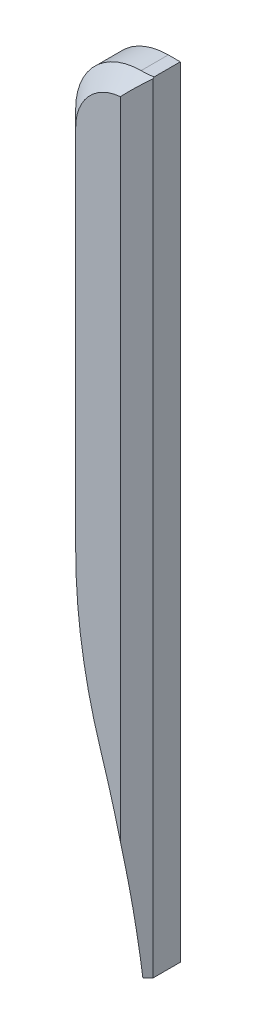
ISO-10303-21;
HEADER;
FILE_DESCRIPTION(('STEP AP214'),'2;1');
FILE_NAME('part.step','',(''),(''),'','','');
FILE_SCHEMA(('AUTOMOTIVE_DESIGN { 1 0 10303 214 1 1 1 1 }'));
ENDSEC;
DATA;
#1=APPLICATION_CONTEXT('core data for automotive mechanical design processes');
#2=APPLICATION_PROTOCOL_DEFINITION('international standard','automotive_design',2000,#1);
#3=PRODUCT_CONTEXT('',#1,'mechanical');
#4=PRODUCT('Part','Part','',(#3));
#5=PRODUCT_RELATED_PRODUCT_CATEGORY('part','',(#4));
#6=PRODUCT_DEFINITION_FORMATION('','',#4);
#7=PRODUCT_DEFINITION_CONTEXT('part definition',#1,'design');
#8=PRODUCT_DEFINITION('design','',#6,#7);
#9=PRODUCT_DEFINITION_SHAPE('','',#8);
#10=(LENGTH_UNIT() NAMED_UNIT(*) SI_UNIT(.MILLI.,.METRE.));
#11=(NAMED_UNIT(*) PLANE_ANGLE_UNIT() SI_UNIT($,.RADIAN.));
#12=(NAMED_UNIT(*) SI_UNIT($,.STERADIAN.) SOLID_ANGLE_UNIT());
#13=UNCERTAINTY_MEASURE_WITH_UNIT(LENGTH_MEASURE(1.E-05),#10,'distance_accuracy_value','');
#14=(GEOMETRIC_REPRESENTATION_CONTEXT(3) GLOBAL_UNCERTAINTY_ASSIGNED_CONTEXT((#13)) GLOBAL_UNIT_ASSIGNED_CONTEXT((#10,
#11,#12)) REPRESENTATION_CONTEXT('',''));
#15=CARTESIAN_POINT('',(0.,0.,0.));
#16=DIRECTION('',(0.,0.,1.));
#17=DIRECTION('',(1.,0.,0.));
#18=AXIS2_PLACEMENT_3D('',#15,#16,#17);
#19=CARTESIAN_POINT('',(-1.09999999999947,79.2576753062959,4.));
#20=DIRECTION('',(0.,0.,-1.));
#21=DIRECTION('',(-1.,0.,0.));
#22=AXIS2_PLACEMENT_3D('',#19,#20,#21);
#23=CYLINDRICAL_SURFACE('',#22,5.99999999999999);
#24=DIRECTION('',(0.,0.,-1.));
#25=VECTOR('',#24,1.);
#26=CARTESIAN_POINT('',(-7.09999999999946,79.2576753062959,4.));
#27=LINE('',#26,#25);
#28=CARTESIAN_POINT('',(-7.09999999999946,79.2576753062959,2.49999999999999));
#29=VERTEX_POINT('',#28);
#30=CARTESIAN_POINT('',(-7.09999999999946,79.2576753062959,0.));
#31=VERTEX_POINT('',#30);
#32=EDGE_CURVE('E141',#29,#31,#27,.T.);
#33=ORIENTED_EDGE('',*,*,#32,.F.);
#34=CARTESIAN_POINT('',(-1.09999999999947,79.2576753062959,2.49999999999999));
#35=DIRECTION('',(0.,0.,1.));
#36=DIRECTION('',(1.,0.,0.));
#37=AXIS2_PLACEMENT_3D('',#34,#35,#36);
#38=CIRCLE('',#37,5.99999999999999);
#39=CARTESIAN_POINT('',(-1.10000000000005,85.2576753062959,2.49999999999999));
#40=VERTEX_POINT('',#39);
#41=EDGE_CURVE('E232',#29,#40,#38,.F.);
#42=ORIENTED_EDGE('',*,*,#41,.T.);
#43=DIRECTION('',(0.,0.,-1.));
#44=VECTOR('',#43,1.);
#45=CARTESIAN_POINT('',(-1.10000000000005,85.2576753062959,4.));
#46=LINE('',#45,#44);
#47=CARTESIAN_POINT('',(-1.10000000000005,85.2576753062959,0.));
#48=VERTEX_POINT('',#47);
#49=EDGE_CURVE('E149',#40,#48,#46,.T.);
#50=ORIENTED_EDGE('',*,*,#49,.T.);
#51=CARTESIAN_POINT('',(-1.09999999999947,79.2576753062959,0.));
#52=DIRECTION('',(0.,0.,1.));
#53=DIRECTION('',(1.,0.,0.));
#54=AXIS2_PLACEMENT_3D('',#51,#52,#53);
#55=CIRCLE('',#54,5.99999999999999);
#56=EDGE_CURVE('E270',#48,#31,#55,.T.);
#57=ORIENTED_EDGE('',*,*,#56,.T.);
#58=EDGE_LOOP('',(#33,#42,#50,#57));
#59=FACE_BOUND('',#58,.T.);
#60=ADVANCED_FACE('F37',(#59),#23,.T.);
#61=CARTESIAN_POINT('',(-7.09999999999946,79.2576753062959,4.));
#62=DIRECTION('',(1.,0.,0.));
#63=DIRECTION('',(0.,0.,-1.));
#64=AXIS2_PLACEMENT_3D('',#61,#62,#63);
#65=PLANE('',#64);
#66=DIRECTION('',(0.,0.,-1.));
#67=VECTOR('',#66,1.);
#68=CARTESIAN_POINT('',(-7.09999999999946,45.6025218600902,4.));
#69=LINE('',#68,#67);
#70=CARTESIAN_POINT('',(-7.09999999999946,45.6025218600902,2.49999999999999));
#71=VERTEX_POINT('',#70);
#72=CARTESIAN_POINT('',(-7.09999999999946,45.6025218600902,0.));
#73=VERTEX_POINT('',#72);
#74=EDGE_CURVE('E160',#71,#73,#69,.T.);
#75=ORIENTED_EDGE('',*,*,#74,.F.);
#76=DIRECTION('',(0.,1.,0.));
#77=VECTOR('',#76,1.);
#78=CARTESIAN_POINT('',(-7.09999999999946,79.2576753062959,2.49999999999999));
#79=LINE('',#78,#77);
#80=EDGE_CURVE('E11',#71,#29,#79,.T.);
#81=ORIENTED_EDGE('',*,*,#80,.T.);
#82=ORIENTED_EDGE('',*,*,#32,.T.);
#83=DIRECTION('',(0.,-1.,0.));
#84=VECTOR('',#83,1.);
#85=CARTESIAN_POINT('',(-7.09999999999946,79.2576753062959,0.));
#86=LINE('',#85,#84);
#87=EDGE_CURVE('E272',#31,#73,#86,.T.);
#88=ORIENTED_EDGE('',*,*,#87,.T.);
#89=EDGE_LOOP('',(#75,#81,#82,#88));
#90=FACE_BOUND('',#89,.T.);
#91=ADVANCED_FACE('F277',(#90),#65,.F.);
#92=CARTESIAN_POINT('',(42.9000000000005,45.6025218600902,4.));
#93=DIRECTION('',(0.,0.,-1.));
#94=DIRECTION('',(-1.,0.,0.));
#95=AXIS2_PLACEMENT_3D('',#92,#93,#94);
#96=CYLINDRICAL_SURFACE('',#95,50.);
#97=DIRECTION('',(0.,0.,-1.));
#98=VECTOR('',#97,1.);
#99=CARTESIAN_POINT('',(-4.73333333333305,30.4016812400601,4.));
#100=LINE('',#99,#98);
#101=CARTESIAN_POINT('',(-4.73333333333305,30.4016812400601,2.49999999999999));
#102=VERTEX_POINT('',#101);
#103=CARTESIAN_POINT('',(-4.73333333333305,30.4016812400601,0.));
#104=VERTEX_POINT('',#103);
#105=EDGE_CURVE('E158',#102,#104,#100,.T.);
#106=ORIENTED_EDGE('',*,*,#105,.F.);
#107=CARTESIAN_POINT('',(42.9000000000005,45.6025218600902,2.49999999999999));
#108=DIRECTION('',(0.,0.,1.));
#109=DIRECTION('',(1.,0.,0.));
#110=AXIS2_PLACEMENT_3D('',#107,#108,#109);
#111=CIRCLE('',#110,50.);
#112=EDGE_CURVE('E47',#102,#71,#111,.F.);
#113=ORIENTED_EDGE('',*,*,#112,.T.);
#114=ORIENTED_EDGE('',*,*,#74,.T.);
#115=CARTESIAN_POINT('',(42.9000000000005,45.6025218600902,0.));
#116=DIRECTION('',(0.,0.,1.));
#117=DIRECTION('',(1.,0.,0.));
#118=AXIS2_PLACEMENT_3D('',#115,#116,#117);
#119=CIRCLE('',#118,50.);
#120=EDGE_CURVE('E151',#73,#104,#119,.T.);
#121=ORIENTED_EDGE('',*,*,#120,.T.);
#122=EDGE_LOOP('',(#106,#113,#114,#121));
#123=FACE_BOUND('',#122,.T.);
#124=ADVANCED_FACE('F263',(#123),#96,.T.);
#125=CARTESIAN_POINT('',(-99.9999999999995,0.,4.));
#126=DIRECTION('',(0.,0.,-1.));
#127=DIRECTION('',(-1.,0.,0.));
#128=AXIS2_PLACEMENT_3D('',#125,#126,#127);
#129=CYLINDRICAL_SURFACE('',#128,99.9999999999998);
#130=DIRECTION('',(0.,0.,-1.));
#131=VECTOR('',#130,1.);
#132=CARTESIAN_POINT('',(-0.938840704638136,13.6706517422909,4.));
#133=LINE('',#132,#131);
#134=CARTESIAN_POINT('',(-0.938840704638136,13.6706517422909,0.));
#135=VERTEX_POINT('',#134);
#136=CARTESIAN_POINT('',(-0.938840704638136,13.6706517422909,2.49999999999999));
#137=VERTEX_POINT('',#136);
#138=EDGE_CURVE('E131',#135,#137,#133,.F.);
#139=ORIENTED_EDGE('',*,*,#138,.T.);
#140=CARTESIAN_POINT('',(-99.9999999999995,0.,2.49999999999999));
#141=DIRECTION('',(0.,0.,1.));
#142=DIRECTION('',(1.,0.,0.));
#143=AXIS2_PLACEMENT_3D('',#140,#141,#142);
#144=CIRCLE('',#143,99.9999999999998);
#145=EDGE_CURVE('E209',#137,#102,#144,.T.);
#146=ORIENTED_EDGE('',*,*,#145,.T.);
#147=ORIENTED_EDGE('',*,*,#105,.T.);
#148=CARTESIAN_POINT('',(-99.9999999999995,0.,0.));
#149=DIRECTION('',(0.,0.,-1.));
#150=DIRECTION('',(1.,0.,0.));
#151=AXIS2_PLACEMENT_3D('',#148,#149,#150);
#152=CIRCLE('',#151,99.9999999999998);
#153=EDGE_CURVE('E147',#104,#135,#152,.T.);
#154=ORIENTED_EDGE('',*,*,#153,.T.);
#155=EDGE_LOOP('',(#139,#146,#147,#154));
#156=FACE_BOUND('',#155,.T.);
#157=ADVANCED_FACE('F260',(#156),#129,.F.);
#158=CARTESIAN_POINT('',(0.,0.,4.));
#159=DIRECTION('',(-1.,0.,0.));
#160=DIRECTION('',(0.,-1.,0.));
#161=AXIS2_PLACEMENT_3D('',#158,#159,#160);
#162=PLANE('',#161);
#163=DIRECTION('',(0.,0.,-1.));
#164=VECTOR('',#163,1.);
#165=CARTESIAN_POINT('',(-5.50774703622636E-13,85.2576753062959,4.));
#166=LINE('',#165,#164);
#167=CARTESIAN_POINT('',(-5.50774703622636E-13,85.2576753062959,2.40000000000019));
#168=VERTEX_POINT('',#167);
#169=CARTESIAN_POINT('',(-5.50774703622636E-13,85.2576753062959,0.));
#170=VERTEX_POINT('',#169);
#171=EDGE_CURVE('E156',#168,#170,#166,.T.);
#172=ORIENTED_EDGE('',*,*,#171,.F.);
#173=CARTESIAN_POINT('',(-5.50774703622636E-13,85.2576753062959,2.40000000000019));
#174=CARTESIAN_POINT('',(-5.50665225056846E-13,85.2407284675544,2.41666906096395));
#175=CARTESIAN_POINT('',(-5.50555738874105E-13,85.2237804516193,2.4333369247788));
#176=CARTESIAN_POINT('',(-5.50336751274715E-13,85.1898820653606,2.46667025811206));
#177=CARTESIAN_POINT('',(-5.50227249858065E-13,85.1729316950369,2.48333572763048));
#178=CARTESIAN_POINT('',(-5.50117740824464E-13,85.1559801475196,2.49999999999998));
#179=B_SPLINE_CURVE_WITH_KNOTS('',3,(#173,#174,#175,#176,#177,#178),.UNSPECIFIED.,.F.,.F.,(4,2,
4),(0.,0.0713125259304227,0.142625051866725),.UNSPECIFIED.);
#180=CARTESIAN_POINT('',(-5.50117740824464E-13,85.1559801475196,2.49999999999999));
#181=VERTEX_POINT('',#180);
#182=EDGE_CURVE('E231',#168,#181,#179,.T.);
#183=ORIENTED_EDGE('',*,*,#182,.T.);
#184=DIRECTION('',(0.,-1.,0.));
#185=VECTOR('',#184,1.);
#186=CARTESIAN_POINT('',(0.,13.6706517422909,2.49999999999999));
#187=LINE('',#186,#185);
#188=CARTESIAN_POINT('',(0.,13.6706517422909,2.49999999999999));
#189=VERTEX_POINT('',#188);
#190=EDGE_CURVE('E127',#181,#189,#187,.T.);
#191=ORIENTED_EDGE('',*,*,#190,.T.);
#192=DIRECTION('',(0.,0.,-1.));
#193=VECTOR('',#192,1.);
#194=CARTESIAN_POINT('',(0.,13.6706517422909,4.));
#195=LINE('',#194,#193);
#196=CARTESIAN_POINT('',(2.91433543964104E-13,13.6706517422909,0.));
#197=VERTEX_POINT('',#196);
#198=EDGE_CURVE('E120',#189,#197,#195,.T.);
#199=ORIENTED_EDGE('',*,*,#198,.T.);
#200=DIRECTION('',(0.,1.,0.));
#201=VECTOR('',#200,1.);
#202=CARTESIAN_POINT('',(0.,0.,0.));
#203=LINE('',#202,#201);
#204=EDGE_CURVE('E124',#197,#170,#203,.T.);
#205=ORIENTED_EDGE('',*,*,#204,.T.);
#206=EDGE_LOOP('',(#172,#183,#191,#199,#205));
#207=FACE_BOUND('',#206,.T.);
#208=ADVANCED_FACE('F122',(#207),#162,.F.);
#209=CARTESIAN_POINT('',(-1.10000000000005,85.2576753062959,4.));
#210=DIRECTION('',(0.,-1.,0.));
#211=DIRECTION('',(0.,0.,-1.));
#212=AXIS2_PLACEMENT_3D('',#209,#210,#211);
#213=PLANE('',#212);
#214=ORIENTED_EDGE('',*,*,#49,.F.);
#215=CARTESIAN_POINT('',(-1.10000000000005,85.2576753062959,2.49999999999999));
#216=CARTESIAN_POINT('',(-1.00773546685145,85.2576753062959,2.50001037503593));
#217=CARTESIAN_POINT('',(-0.915473626922802,85.2576753062959,2.49787187895306));
#218=CARTESIAN_POINT('',(-0.731328290662296,85.2576753062959,2.4893837236359));
#219=CARTESIAN_POINT('',(-0.639444406689946,85.2576753062959,2.48304249558077));
#220=CARTESIAN_POINT('',(-0.456062673737183,85.2576753062959,2.46623534308254));
#221=CARTESIAN_POINT('',(-0.364564802703676,85.2576753062959,2.45576965758722));
#222=CARTESIAN_POINT('',(-0.181926672261233,85.2576753062959,2.43084558357959));
#223=CARTESIAN_POINT('',(-0.090787497124509,85.2576753062959,2.41637923483939));
#224=CARTESIAN_POINT('',(-5.50818071709544E-13,85.2576753062959,2.40000000000019));
#225=B_SPLINE_CURVE_WITH_KNOTS('',3,(#215,#216,#217,#218,#219,#220,#221,#222,#223,#224),
.UNSPECIFIED.,.F.,.F.,(4,2,2,2,4),(0.,0.276764673300055,0.552975797649888,0.829170922238586,
1.10591960347553),.UNSPECIFIED.);
#226=EDGE_CURVE('E62',#40,#168,#225,.T.);
#227=ORIENTED_EDGE('',*,*,#226,.T.);
#228=ORIENTED_EDGE('',*,*,#171,.T.);
#229=DIRECTION('',(-1.,0.,0.));
#230=VECTOR('',#229,1.);
#231=CARTESIAN_POINT('',(-1.10000000000005,85.2576753062959,0.));
#232=LINE('',#231,#230);
#233=EDGE_CURVE('E146',#170,#48,#232,.T.);
#234=ORIENTED_EDGE('',*,*,#233,.T.);
#235=EDGE_LOOP('',(#214,#227,#228,#234));
#236=FACE_BOUND('',#235,.T.);
#237=ADVANCED_FACE('F217',(#236),#213,.F.);
#238=CARTESIAN_POINT('',(-1.09999999999947,79.2576753062959,4.));
#239=DIRECTION('',(0.,0.,1.));
#240=DIRECTION('',(1.,0.,0.));
#241=AXIS2_PLACEMENT_3D('',#238,#239,#240);
#242=PLANE('',#241);
#243=CARTESIAN_POINT('',(42.9000000000005,45.6025218600902,4.));
#244=DIRECTION('',(0.,0.,1.));
#245=DIRECTION('',(1.,0.,0.));
#246=AXIS2_PLACEMENT_3D('',#243,#244,#245);
#247=CIRCLE('',#246,48.5);
#248=CARTESIAN_POINT('',(-5.59999999999945,45.6025218600902,4.));
#249=VERTEX_POINT('',#248);
#250=CARTESIAN_POINT('',(-3.30433333333278,30.857706458661,4.));
#251=VERTEX_POINT('',#250);
#252=EDGE_CURVE('E170',#249,#251,#247,.T.);
#253=ORIENTED_EDGE('',*,*,#252,.T.);
#254=CARTESIAN_POINT('',(-99.9999999999995,0.,4.));
#255=DIRECTION('',(0.,0.,1.));
#256=DIRECTION('',(1.,0.,0.));
#257=AXIS2_PLACEMENT_3D('',#254,#255,#256);
#258=CIRCLE('',#257,101.5);
#259=CARTESIAN_POINT('',(-1.50000000000017,24.4948974278336,4.));
#260=VERTEX_POINT('',#259);
#261=EDGE_CURVE('E174',#251,#260,#258,.F.);
#262=ORIENTED_EDGE('',*,*,#261,.T.);
#263=DIRECTION('',(0.,1.,0.));
#264=VECTOR('',#263,1.);
#265=CARTESIAN_POINT('',(-1.50000000000056,85.2576753062959,4.));
#266=LINE('',#265,#264);
#267=CARTESIAN_POINT('',(-1.50000000000055,83.7398622724988,4.));
#268=VERTEX_POINT('',#267);
#269=EDGE_CURVE('E140',#260,#268,#266,.T.);
#270=ORIENTED_EDGE('',*,*,#269,.T.);
#271=CARTESIAN_POINT('',(-1.09999999999947,79.2576753062959,4.));
#272=DIRECTION('',(0.,0.,1.));
#273=DIRECTION('',(1.,0.,0.));
#274=AXIS2_PLACEMENT_3D('',#271,#272,#273);
#275=CIRCLE('',#274,4.49999999999998);
#276=CARTESIAN_POINT('',(-5.59999999999945,79.2576753062959,4.));
#277=VERTEX_POINT('',#276);
#278=EDGE_CURVE('E172',#268,#277,#275,.T.);
#279=ORIENTED_EDGE('',*,*,#278,.T.);
#280=DIRECTION('',(0.,-1.,0.));
#281=VECTOR('',#280,1.);
#282=CARTESIAN_POINT('',(-5.59999999999945,45.6025218600902,4.));
#283=LINE('',#282,#281);
#284=EDGE_CURVE('E168',#277,#249,#283,.T.);
#285=ORIENTED_EDGE('',*,*,#284,.T.);
#286=EDGE_LOOP('',(#253,#262,#270,#279,#285));
#287=FACE_BOUND('',#286,.T.);
#288=ADVANCED_FACE('F214',(#287),#242,.T.);
#289=CARTESIAN_POINT('',(-1.09999999999947,79.2576753062959,0.));
#290=DIRECTION('',(0.,0.,1.));
#291=DIRECTION('',(1.,0.,0.));
#292=AXIS2_PLACEMENT_3D('',#289,#290,#291);
#293=PLANE('',#292);
#294=ORIENTED_EDGE('',*,*,#204,.F.);
#295=DIRECTION('',(-1.,0.,0.));
#296=VECTOR('',#295,1.);
#297=CARTESIAN_POINT('',(-1.09999999999947,13.6706517422909,0.));
#298=LINE('',#297,#296);
#299=EDGE_CURVE('E134',#197,#135,#298,.T.);
#300=ORIENTED_EDGE('',*,*,#299,.T.);
#301=ORIENTED_EDGE('',*,*,#153,.F.);
#302=ORIENTED_EDGE('',*,*,#120,.F.);
#303=ORIENTED_EDGE('',*,*,#87,.F.);
#304=ORIENTED_EDGE('',*,*,#56,.F.);
#305=ORIENTED_EDGE('',*,*,#233,.F.);
#306=EDGE_LOOP('',(#294,#300,#301,#302,#303,#304,#305));
#307=FACE_BOUND('',#306,.T.);
#308=ADVANCED_FACE('F143',(#307),#293,.F.);
#309=CARTESIAN_POINT('',(-4.03364402356295,13.6706517422909,0.));
#310=DIRECTION('',(0.,1.,0.));
#311=DIRECTION('',(0.,0.,1.));
#312=AXIS2_PLACEMENT_3D('',#309,#310,#311);
#313=PLANE('',#312);
#314=DIRECTION('',(-0.707106781186548,0.,0.707106781186548));
#315=VECTOR('',#314,1.);
#316=CARTESIAN_POINT('',(-1.50000000000031,13.6706517422909,4.00000000000021));
#317=LINE('',#316,#315);
#318=CARTESIAN_POINT('',(-0.46721679764735,13.6706517422909,2.96721679764726));
#319=VERTEX_POINT('',#318);
#320=EDGE_CURVE('E166',#189,#319,#317,.T.);
#321=ORIENTED_EDGE('',*,*,#320,.T.);
#322=CARTESIAN_POINT('',(-0.46721679764735,13.6706517422909,2.96721679764726));
#323=CARTESIAN_POINT('',(-0.54581906225059,13.6706517422909,2.8893455952543));
#324=CARTESIAN_POINT('',(-0.624422186801432,13.6706517422909,2.81147526092056));
#325=CARTESIAN_POINT('',(-0.781630155798364,13.6706517422909,2.65573632837147));
#326=CARTESIAN_POINT('',(-0.860235000244454,13.6706517422909,2.57786773015612));
#327=CARTESIAN_POINT('',(-0.938840704638146,13.6706517422909,2.49999999999999));
#328=B_SPLINE_CURVE_WITH_KNOTS('',3,(#322,#323,#324,#325,#326,#327),.UNSPECIFIED.,.F.,.F.,(4,2,
4),(0.,0.33193397148474,0.663867942969669),.UNSPECIFIED.);
#329=EDGE_CURVE('E203',#319,#137,#328,.T.);
#330=ORIENTED_EDGE('',*,*,#329,.T.);
#331=ORIENTED_EDGE('',*,*,#138,.F.);
#332=ORIENTED_EDGE('',*,*,#299,.F.);
#333=ORIENTED_EDGE('',*,*,#198,.F.);
#334=EDGE_LOOP('',(#321,#330,#331,#332,#333));
#335=FACE_BOUND('',#334,.T.);
#336=ADVANCED_FACE('F135',(#335),#313,.F.);
#337=CARTESIAN_POINT('',(-1.50000000000052,79.2576753062959,4.));
#338=DIRECTION('',(0.707106781186548,0.,0.707106781186548));
#339=DIRECTION('',(0.,-1.,0.));
#340=AXIS2_PLACEMENT_3D('',#337,#338,#339);
#341=PLANE('',#340);
#342=ORIENTED_EDGE('',*,*,#269,.F.);
#343=CARTESIAN_POINT('',(-1.50000000000017,24.4948974278336,4.));
#344=CARTESIAN_POINT('',(-1.39011248195796,23.5976905301769,3.8901124819578));
#345=CARTESIAN_POINT('',(-1.28609111756766,22.6990438658423,3.78609111756751));
#346=CARTESIAN_POINT('',(-1.08994821764815,20.8994821236097,3.58994821764801));
#347=CARTESIAN_POINT('',(-0.997822495134106,19.9985679582711,3.49782249513397));
#348=CARTESIAN_POINT('',(-0.825560219665354,18.1944441237996,3.32556021966523));
#349=CARTESIAN_POINT('',(-0.745423726156486,17.2912344433076,3.24542372615637));
#350=CARTESIAN_POINT('',(-0.597224456386855,15.4825133792299,3.09722445638675));
#351=CARTESIAN_POINT('',(-0.529165952940331,14.5770012955806,3.02916595294023));
#352=CARTESIAN_POINT('',(-0.467216797647405,13.6706517422909,2.96721679764731));
#353=B_SPLINE_CURVE_WITH_KNOTS('',3,(#343,#344,#345,#346,#347,#348,#349,#350,#351,#352),
.UNSPECIFIED.,.F.,.F.,(4,2,2,2,4),(0.,2.73166364752306,5.46236317779077,8.19307624715562,
10.9247534397492),.UNSPECIFIED.);
#354=EDGE_CURVE('E183',#260,#319,#353,.T.);
#355=ORIENTED_EDGE('',*,*,#354,.T.);
#356=ORIENTED_EDGE('',*,*,#320,.F.);
#357=ORIENTED_EDGE('',*,*,#190,.F.);
#358=CARTESIAN_POINT('',(-5.50117740824464E-13,85.1559801475196,2.49999999999999));
#359=CARTESIAN_POINT('',(-0.12969954570845,85.048206015603,2.62969954570789));
#360=CARTESIAN_POINT('',(-0.258515503448136,84.9382656634776,2.75851550344758));
#361=CARTESIAN_POINT('',(-0.513855426524801,84.7135803420749,3.01385542652425));
#362=CARTESIAN_POINT('',(-0.640381530879737,84.5988402277484,3.14038153087918));
#363=CARTESIAN_POINT('',(-0.89091914928179,84.3638309353851,3.39091914928124));
#364=CARTESIAN_POINT('',(-1.01492975755621,84.2435598149574,3.51492975755566));
#365=CARTESIAN_POINT('',(-1.25992075523418,83.9966522211214,3.75992075523363));
#366=CARTESIAN_POINT('',(-1.38089801762774,83.8700095535104,3.88089801762719));
#367=CARTESIAN_POINT('',(-1.50000000000055,83.7398622724988,4.));
#368=B_SPLINE_CURVE_WITH_KNOTS('',3,(#358,#359,#360,#361,#362,#363,#364,#365,#366,#367),
.UNSPECIFIED.,.F.,.F.,(4,2,2,2,4),(0.,0.638240002508876,1.27584933856847,1.91368432760824,
2.55215185397695),.UNSPECIFIED.);
#369=EDGE_CURVE('E177',#181,#268,#368,.T.);
#370=ORIENTED_EDGE('',*,*,#369,.T.);
#371=EDGE_LOOP('',(#342,#355,#356,#357,#370));
#372=FACE_BOUND('',#371,.T.);
#373=ADVANCED_FACE('F189',(#372),#341,.T.);
#374=CARTESIAN_POINT('',(-1.09999999999947,79.2576753062959,4.));
#375=DIRECTION('',(0.,0.,-1.));
#376=DIRECTION('',(-1.,0.,0.));
#377=AXIS2_PLACEMENT_3D('',#374,#375,#376);
#378=CONICAL_SURFACE('',#377,4.49999999999998,0.785398163397448);
#379=ORIENTED_EDGE('',*,*,#226,.F.);
#380=ORIENTED_EDGE('',*,*,#41,.F.);
#381=DIRECTION('',(-0.707106781186548,0.,-0.707106781186548));
#382=VECTOR('',#381,1.);
#383=CARTESIAN_POINT('',(-5.59999999999945,79.2576753062959,4.));
#384=LINE('',#383,#382);
#385=EDGE_CURVE('E42',#277,#29,#384,.T.);
#386=ORIENTED_EDGE('',*,*,#385,.F.);
#387=ORIENTED_EDGE('',*,*,#278,.F.);
#388=ORIENTED_EDGE('',*,*,#369,.F.);
#389=ORIENTED_EDGE('',*,*,#182,.F.);
#390=EDGE_LOOP('',(#379,#380,#386,#387,#388,#389));
#391=FACE_BOUND('',#390,.T.);
#392=ADVANCED_FACE('F39',(#391),#378,.T.);
#393=CARTESIAN_POINT('',(-5.59999999999945,79.2576753062959,4.));
#394=DIRECTION('',(-0.707106781186548,0.,0.707106781186548));
#395=DIRECTION('',(0.,1.,0.));
#396=AXIS2_PLACEMENT_3D('',#393,#394,#395);
#397=PLANE('',#396);
#398=ORIENTED_EDGE('',*,*,#385,.T.);
#399=ORIENTED_EDGE('',*,*,#80,.F.);
#400=DIRECTION('',(-0.707106781186548,0.,-0.707106781186548));
#401=VECTOR('',#400,1.);
#402=CARTESIAN_POINT('',(-5.59999999999945,45.6025218600902,4.));
#403=LINE('',#402,#401);
#404=EDGE_CURVE('E240',#249,#71,#403,.T.);
#405=ORIENTED_EDGE('',*,*,#404,.F.);
#406=ORIENTED_EDGE('',*,*,#284,.F.);
#407=EDGE_LOOP('',(#398,#399,#405,#406));
#408=FACE_BOUND('',#407,.T.);
#409=ADVANCED_FACE('F250',(#408),#397,.T.);
#410=CARTESIAN_POINT('',(42.9000000000005,45.6025218600902,4.));
#411=DIRECTION('',(0.,0.,-1.));
#412=DIRECTION('',(-1.,0.,0.));
#413=AXIS2_PLACEMENT_3D('',#410,#411,#412);
#414=CONICAL_SURFACE('',#413,48.5,0.785398163397448);
#415=ORIENTED_EDGE('',*,*,#404,.T.);
#416=ORIENTED_EDGE('',*,*,#112,.F.);
#417=DIRECTION('',(-0.673637060210384,-0.214972349643183,-0.707106781186548));
#418=VECTOR('',#417,1.);
#419=CARTESIAN_POINT('',(-3.30433333333278,30.857706458661,4.));
#420=LINE('',#419,#418);
#421=EDGE_CURVE('E238',#251,#102,#420,.T.);
#422=ORIENTED_EDGE('',*,*,#421,.F.);
#423=ORIENTED_EDGE('',*,*,#252,.F.);
#424=EDGE_LOOP('',(#415,#416,#422,#423));
#425=FACE_BOUND('',#424,.T.);
#426=ADVANCED_FACE('F200',(#425),#414,.T.);
#427=CARTESIAN_POINT('',(-99.9999999999995,0.,4.));
#428=DIRECTION('',(0.,0.,1.));
#429=DIRECTION('',(1.,0.,0.));
#430=AXIS2_PLACEMENT_3D('',#427,#428,#429);
#431=CONICAL_SURFACE('',#430,101.5,0.785398163397446);
#432=ORIENTED_EDGE('',*,*,#421,.T.);
#433=ORIENTED_EDGE('',*,*,#145,.F.);
#434=ORIENTED_EDGE('',*,*,#329,.F.);
#435=ORIENTED_EDGE('',*,*,#354,.F.);
#436=ORIENTED_EDGE('',*,*,#261,.F.);
#437=EDGE_LOOP('',(#432,#433,#434,#435,#436));
#438=FACE_BOUND('',#437,.T.);
#439=ADVANCED_FACE('F195',(#438),#431,.F.);
#440=CLOSED_SHELL('',(#60,#91,#124,#157,#208,#237,#288,#308,#336,#373,#392,#409,#426,#439));
#441=MANIFOLD_SOLID_BREP('B2',#440);
#442=ADVANCED_BREP_SHAPE_REPRESENTATION('',(#18,#441),#14);
#443=SHAPE_DEFINITION_REPRESENTATION(#9,#442);
ENDSEC;
END-ISO-10303-21;
